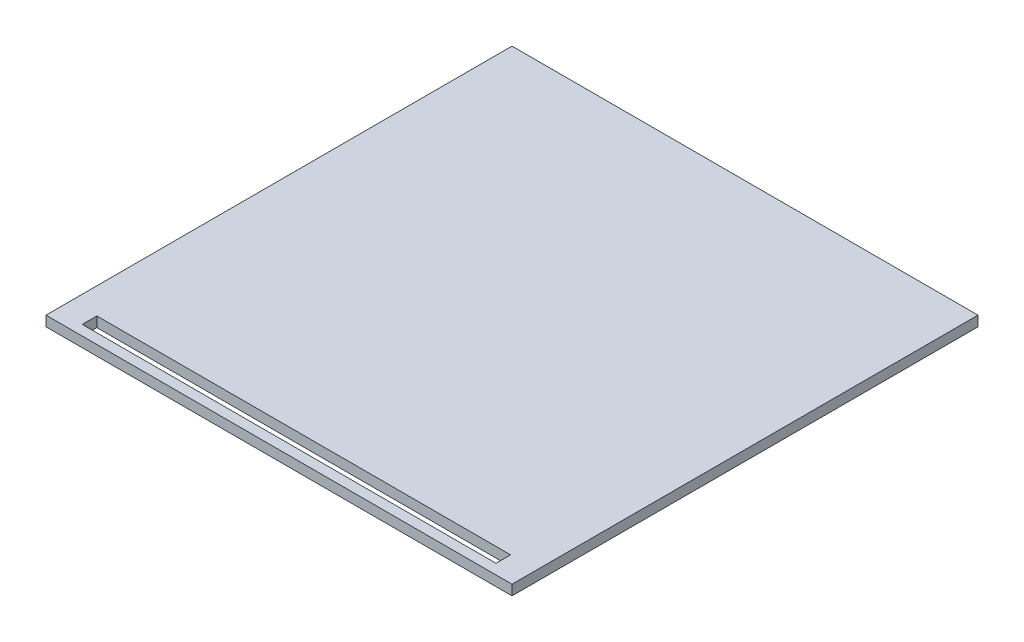
ISO-10303-21;
HEADER;
FILE_DESCRIPTION(('STEP AP214'),'2;1');
FILE_NAME('part.step','',(''),(''),'','','');
FILE_SCHEMA(('AUTOMOTIVE_DESIGN { 1 0 10303 214 1 1 1 1 }'));
ENDSEC;
DATA;
#1=APPLICATION_CONTEXT('core data for automotive mechanical design processes');
#2=APPLICATION_PROTOCOL_DEFINITION('international standard','automotive_design',2000,#1);
#3=PRODUCT_CONTEXT('',#1,'mechanical');
#4=PRODUCT('Part','Part','',(#3));
#5=PRODUCT_RELATED_PRODUCT_CATEGORY('part','',(#4));
#6=PRODUCT_DEFINITION_FORMATION('','',#4);
#7=PRODUCT_DEFINITION_CONTEXT('part definition',#1,'design');
#8=PRODUCT_DEFINITION('design','',#6,#7);
#9=PRODUCT_DEFINITION_SHAPE('','',#8);
#10=(LENGTH_UNIT() NAMED_UNIT(*) SI_UNIT(.MILLI.,.METRE.));
#11=(NAMED_UNIT(*) PLANE_ANGLE_UNIT() SI_UNIT($,.RADIAN.));
#12=(NAMED_UNIT(*) SI_UNIT($,.STERADIAN.) SOLID_ANGLE_UNIT());
#13=UNCERTAINTY_MEASURE_WITH_UNIT(LENGTH_MEASURE(1.E-05),#10,'distance_accuracy_value','');
#14=(GEOMETRIC_REPRESENTATION_CONTEXT(3) GLOBAL_UNCERTAINTY_ASSIGNED_CONTEXT((#13)) GLOBAL_UNIT_ASSIGNED_CONTEXT((#10,
#11,#12)) REPRESENTATION_CONTEXT('',''));
#15=CARTESIAN_POINT('',(0.,0.,0.));
#16=DIRECTION('',(0.,0.,1.));
#17=DIRECTION('',(1.,0.,0.));
#18=AXIS2_PLACEMENT_3D('',#15,#16,#17);
#19=CARTESIAN_POINT('',(115.,5.,115.));
#20=DIRECTION('',(-1.,0.,0.));
#21=DIRECTION('',(0.,0.,1.));
#22=AXIS2_PLACEMENT_3D('',#19,#20,#21);
#23=PLANE('',#22);
#24=DIRECTION('',(0.,0.,-1.));
#25=VECTOR('',#24,1.);
#26=CARTESIAN_POINT('',(115.,0.,115.));
#27=LINE('',#26,#25);
#28=CARTESIAN_POINT('',(115.,0.,115.));
#29=VERTEX_POINT('',#28);
#30=CARTESIAN_POINT('',(115.,0.,-115.));
#31=VERTEX_POINT('',#30);
#32=EDGE_CURVE('E131',#29,#31,#27,.T.);
#33=ORIENTED_EDGE('',*,*,#32,.T.);
#34=DIRECTION('',(0.,-1.,0.));
#35=VECTOR('',#34,1.);
#36=CARTESIAN_POINT('',(115.,5.,-115.));
#37=LINE('',#36,#35);
#38=CARTESIAN_POINT('',(115.,5.,-115.));
#39=VERTEX_POINT('',#38);
#40=EDGE_CURVE('E11',#39,#31,#37,.T.);
#41=ORIENTED_EDGE('',*,*,#40,.F.);
#42=DIRECTION('',(0.,0.,-1.));
#43=VECTOR('',#42,1.);
#44=CARTESIAN_POINT('',(115.,5.,115.));
#45=LINE('',#44,#43);
#46=CARTESIAN_POINT('',(115.,5.,115.));
#47=VERTEX_POINT('',#46);
#48=EDGE_CURVE('E135',#47,#39,#45,.T.);
#49=ORIENTED_EDGE('',*,*,#48,.F.);
#50=DIRECTION('',(0.,-1.,0.));
#51=VECTOR('',#50,1.);
#52=CARTESIAN_POINT('',(115.,5.,115.));
#53=LINE('',#52,#51);
#54=EDGE_CURVE('E145',#47,#29,#53,.T.);
#55=ORIENTED_EDGE('',*,*,#54,.T.);
#56=EDGE_LOOP('',(#33,#41,#49,#55));
#57=FACE_BOUND('',#56,.T.);
#58=ADVANCED_FACE('F34',(#57),#23,.F.);
#59=CARTESIAN_POINT('',(-115.,5.,-115.));
#60=DIRECTION('',(0.,0.,1.));
#61=DIRECTION('',(1.,0.,0.));
#62=AXIS2_PLACEMENT_3D('',#59,#60,#61);
#63=PLANE('',#62);
#64=DIRECTION('',(-1.,0.,0.));
#65=VECTOR('',#64,1.);
#66=CARTESIAN_POINT('',(-115.,0.,-115.));
#67=LINE('',#66,#65);
#68=CARTESIAN_POINT('',(-115.,0.,-115.));
#69=VERTEX_POINT('',#68);
#70=EDGE_CURVE('E148',#31,#69,#67,.T.);
#71=ORIENTED_EDGE('',*,*,#70,.T.);
#72=DIRECTION('',(0.,-1.,0.));
#73=VECTOR('',#72,1.);
#74=CARTESIAN_POINT('',(-115.,5.,-115.));
#75=LINE('',#74,#73);
#76=CARTESIAN_POINT('',(-115.,5.,-115.));
#77=VERTEX_POINT('',#76);
#78=EDGE_CURVE('E41',#77,#69,#75,.T.);
#79=ORIENTED_EDGE('',*,*,#78,.F.);
#80=DIRECTION('',(-1.,0.,0.));
#81=VECTOR('',#80,1.);
#82=CARTESIAN_POINT('',(-115.,5.,-115.));
#83=LINE('',#82,#81);
#84=EDGE_CURVE('E138',#39,#77,#83,.T.);
#85=ORIENTED_EDGE('',*,*,#84,.F.);
#86=ORIENTED_EDGE('',*,*,#40,.T.);
#87=EDGE_LOOP('',(#71,#79,#85,#86));
#88=FACE_BOUND('',#87,.T.);
#89=ADVANCED_FACE('F176',(#88),#63,.F.);
#90=CARTESIAN_POINT('',(-115.,5.,115.));
#91=DIRECTION('',(1.,0.,0.));
#92=DIRECTION('',(0.,0.,-1.));
#93=AXIS2_PLACEMENT_3D('',#90,#91,#92);
#94=PLANE('',#93);
#95=DIRECTION('',(0.,0.,1.));
#96=VECTOR('',#95,1.);
#97=CARTESIAN_POINT('',(-115.,0.,115.));
#98=LINE('',#97,#96);
#99=CARTESIAN_POINT('',(-115.,0.,115.));
#100=VERTEX_POINT('',#99);
#101=EDGE_CURVE('E150',#69,#100,#98,.T.);
#102=ORIENTED_EDGE('',*,*,#101,.T.);
#103=DIRECTION('',(0.,-1.,0.));
#104=VECTOR('',#103,1.);
#105=CARTESIAN_POINT('',(-115.,5.,115.));
#106=LINE('',#105,#104);
#107=CARTESIAN_POINT('',(-115.,5.,115.));
#108=VERTEX_POINT('',#107);
#109=EDGE_CURVE('E155',#108,#100,#106,.T.);
#110=ORIENTED_EDGE('',*,*,#109,.F.);
#111=DIRECTION('',(0.,0.,1.));
#112=VECTOR('',#111,1.);
#113=CARTESIAN_POINT('',(-115.,5.,115.));
#114=LINE('',#113,#112);
#115=EDGE_CURVE('E141',#77,#108,#114,.T.);
#116=ORIENTED_EDGE('',*,*,#115,.F.);
#117=ORIENTED_EDGE('',*,*,#78,.T.);
#118=EDGE_LOOP('',(#102,#110,#116,#117));
#119=FACE_BOUND('',#118,.T.);
#120=ADVANCED_FACE('F162',(#119),#94,.F.);
#121=CARTESIAN_POINT('',(-115.,5.,115.));
#122=DIRECTION('',(0.,0.,-1.));
#123=DIRECTION('',(-1.,0.,0.));
#124=AXIS2_PLACEMENT_3D('',#121,#122,#123);
#125=PLANE('',#124);
#126=DIRECTION('',(1.,0.,0.));
#127=VECTOR('',#126,1.);
#128=CARTESIAN_POINT('',(-115.,0.,115.));
#129=LINE('',#128,#127);
#130=EDGE_CURVE('E139',#100,#29,#129,.T.);
#131=ORIENTED_EDGE('',*,*,#130,.T.);
#132=ORIENTED_EDGE('',*,*,#54,.F.);
#133=DIRECTION('',(1.,0.,0.));
#134=VECTOR('',#133,1.);
#135=CARTESIAN_POINT('',(-115.,5.,115.));
#136=LINE('',#135,#134);
#137=EDGE_CURVE('E143',#108,#47,#136,.T.);
#138=ORIENTED_EDGE('',*,*,#137,.F.);
#139=ORIENTED_EDGE('',*,*,#109,.T.);
#140=EDGE_LOOP('',(#131,#132,#138,#139));
#141=FACE_BOUND('',#140,.T.);
#142=ADVANCED_FACE('F169',(#141),#125,.F.);
#143=CARTESIAN_POINT('',(0.,5.,0.));
#144=DIRECTION('',(0.,-1.,0.));
#145=DIRECTION('',(0.,0.,-1.));
#146=AXIS2_PLACEMENT_3D('',#143,#144,#145);
#147=PLANE('',#146);
#148=DIRECTION('',(-1.,0.,0.));
#149=VECTOR('',#148,1.);
#150=CARTESIAN_POINT('',(102.1,5.,102.8));
#151=LINE('',#150,#149);
#152=CARTESIAN_POINT('',(102.1,5.,102.8));
#153=VERTEX_POINT('',#152);
#154=CARTESIAN_POINT('',(-102.1,5.,102.8));
#155=VERTEX_POINT('',#154);
#156=EDGE_CURVE('E125',#153,#155,#151,.T.);
#157=ORIENTED_EDGE('',*,*,#156,.F.);
#158=DIRECTION('',(0.,0.,-1.));
#159=VECTOR('',#158,1.);
#160=CARTESIAN_POINT('',(102.1,5.,110.));
#161=LINE('',#160,#159);
#162=CARTESIAN_POINT('',(102.1,5.,110.));
#163=VERTEX_POINT('',#162);
#164=EDGE_CURVE('E48',#163,#153,#161,.T.);
#165=ORIENTED_EDGE('',*,*,#164,.F.);
#166=DIRECTION('',(1.,0.,0.));
#167=VECTOR('',#166,1.);
#168=CARTESIAN_POINT('',(102.1,5.,110.));
#169=LINE('',#168,#167);
#170=CARTESIAN_POINT('',(-102.1,5.,110.));
#171=VERTEX_POINT('',#170);
#172=EDGE_CURVE('E116',#171,#163,#169,.T.);
#173=ORIENTED_EDGE('',*,*,#172,.F.);
#174=DIRECTION('',(0.,0.,1.));
#175=VECTOR('',#174,1.);
#176=CARTESIAN_POINT('',(-102.1,5.,110.));
#177=LINE('',#176,#175);
#178=EDGE_CURVE('E119',#155,#171,#177,.T.);
#179=ORIENTED_EDGE('',*,*,#178,.F.);
#180=EDGE_LOOP('',(#157,#165,#173,#179));
#181=FACE_BOUND('',#180,.T.);
#182=ORIENTED_EDGE('',*,*,#48,.T.);
#183=ORIENTED_EDGE('',*,*,#84,.T.);
#184=ORIENTED_EDGE('',*,*,#115,.T.);
#185=ORIENTED_EDGE('',*,*,#137,.T.);
#186=EDGE_LOOP('',(#182,#183,#184,#185));
#187=FACE_BOUND('',#186,.T.);
#188=ADVANCED_FACE('F175',(#181,#187),#147,.F.);
#189=CARTESIAN_POINT('',(0.,0.,0.));
#190=DIRECTION('',(0.,-1.,0.));
#191=DIRECTION('',(0.,0.,-1.));
#192=AXIS2_PLACEMENT_3D('',#189,#190,#191);
#193=PLANE('',#192);
#194=DIRECTION('',(0.,0.,-1.));
#195=VECTOR('',#194,1.);
#196=CARTESIAN_POINT('',(102.1,0.,110.));
#197=LINE('',#196,#195);
#198=CARTESIAN_POINT('',(102.1,0.,110.));
#199=VERTEX_POINT('',#198);
#200=CARTESIAN_POINT('',(102.1,0.,102.8));
#201=VERTEX_POINT('',#200);
#202=EDGE_CURVE('E100',#199,#201,#197,.T.);
#203=ORIENTED_EDGE('',*,*,#202,.T.);
#204=DIRECTION('',(-1.,0.,0.));
#205=VECTOR('',#204,1.);
#206=CARTESIAN_POINT('',(102.1,0.,102.8));
#207=LINE('',#206,#205);
#208=CARTESIAN_POINT('',(-102.1,0.,102.8));
#209=VERTEX_POINT('',#208);
#210=EDGE_CURVE('E109',#201,#209,#207,.T.);
#211=ORIENTED_EDGE('',*,*,#210,.T.);
#212=DIRECTION('',(0.,0.,1.));
#213=VECTOR('',#212,1.);
#214=CARTESIAN_POINT('',(-102.1,0.,110.));
#215=LINE('',#214,#213);
#216=CARTESIAN_POINT('',(-102.1,0.,110.));
#217=VERTEX_POINT('',#216);
#218=EDGE_CURVE('E56',#209,#217,#215,.T.);
#219=ORIENTED_EDGE('',*,*,#218,.T.);
#220=DIRECTION('',(1.,0.,0.));
#221=VECTOR('',#220,1.);
#222=CARTESIAN_POINT('',(102.1,0.,110.));
#223=LINE('',#222,#221);
#224=EDGE_CURVE('E106',#217,#199,#223,.T.);
#225=ORIENTED_EDGE('',*,*,#224,.T.);
#226=EDGE_LOOP('',(#203,#211,#219,#225));
#227=FACE_BOUND('',#226,.T.);
#228=ORIENTED_EDGE('',*,*,#32,.F.);
#229=ORIENTED_EDGE('',*,*,#130,.F.);
#230=ORIENTED_EDGE('',*,*,#101,.F.);
#231=ORIENTED_EDGE('',*,*,#70,.F.);
#232=EDGE_LOOP('',(#228,#229,#230,#231));
#233=FACE_BOUND('',#232,.T.);
#234=ADVANCED_FACE('F113',(#227,#233),#193,.T.);
#235=CARTESIAN_POINT('',(102.1,0.,110.));
#236=DIRECTION('',(1.,0.,0.));
#237=DIRECTION('',(0.,0.,-1.));
#238=AXIS2_PLACEMENT_3D('',#235,#236,#237);
#239=PLANE('',#238);
#240=ORIENTED_EDGE('',*,*,#164,.T.);
#241=DIRECTION('',(0.,1.,0.));
#242=VECTOR('',#241,1.);
#243=CARTESIAN_POINT('',(102.1,0.,102.8));
#244=LINE('',#243,#242);
#245=EDGE_CURVE('E96',#201,#153,#244,.T.);
#246=ORIENTED_EDGE('',*,*,#245,.F.);
#247=ORIENTED_EDGE('',*,*,#202,.F.);
#248=DIRECTION('',(0.,1.,0.));
#249=VECTOR('',#248,1.);
#250=CARTESIAN_POINT('',(102.1,0.,110.));
#251=LINE('',#250,#249);
#252=EDGE_CURVE('E129',#199,#163,#251,.T.);
#253=ORIENTED_EDGE('',*,*,#252,.T.);
#254=EDGE_LOOP('',(#240,#246,#247,#253));
#255=FACE_BOUND('',#254,.T.);
#256=ADVANCED_FACE('F98',(#255),#239,.F.);
#257=CARTESIAN_POINT('',(102.1,0.,110.));
#258=DIRECTION('',(0.,0.,1.));
#259=DIRECTION('',(1.,0.,0.));
#260=AXIS2_PLACEMENT_3D('',#257,#258,#259);
#261=PLANE('',#260);
#262=ORIENTED_EDGE('',*,*,#172,.T.);
#263=ORIENTED_EDGE('',*,*,#252,.F.);
#264=ORIENTED_EDGE('',*,*,#224,.F.);
#265=DIRECTION('',(0.,1.,0.));
#266=VECTOR('',#265,1.);
#267=CARTESIAN_POINT('',(-102.1,0.,110.));
#268=LINE('',#267,#266);
#269=EDGE_CURVE('E132',#217,#171,#268,.T.);
#270=ORIENTED_EDGE('',*,*,#269,.T.);
#271=EDGE_LOOP('',(#262,#263,#264,#270));
#272=FACE_BOUND('',#271,.T.);
#273=ADVANCED_FACE('F193',(#272),#261,.F.);
#274=CARTESIAN_POINT('',(-102.1,0.,110.));
#275=DIRECTION('',(-1.,0.,0.));
#276=DIRECTION('',(0.,0.,1.));
#277=AXIS2_PLACEMENT_3D('',#274,#275,#276);
#278=PLANE('',#277);
#279=ORIENTED_EDGE('',*,*,#178,.T.);
#280=ORIENTED_EDGE('',*,*,#269,.F.);
#281=ORIENTED_EDGE('',*,*,#218,.F.);
#282=DIRECTION('',(0.,1.,0.));
#283=VECTOR('',#282,1.);
#284=CARTESIAN_POINT('',(-102.1,0.,102.8));
#285=LINE('',#284,#283);
#286=EDGE_CURVE('E105',#209,#155,#285,.T.);
#287=ORIENTED_EDGE('',*,*,#286,.T.);
#288=EDGE_LOOP('',(#279,#280,#281,#287));
#289=FACE_BOUND('',#288,.T.);
#290=ADVANCED_FACE('F196',(#289),#278,.F.);
#291=CARTESIAN_POINT('',(102.1,0.,102.8));
#292=DIRECTION('',(0.,0.,-1.));
#293=DIRECTION('',(-1.,0.,0.));
#294=AXIS2_PLACEMENT_3D('',#291,#292,#293);
#295=PLANE('',#294);
#296=ORIENTED_EDGE('',*,*,#156,.T.);
#297=ORIENTED_EDGE('',*,*,#286,.F.);
#298=ORIENTED_EDGE('',*,*,#210,.F.);
#299=ORIENTED_EDGE('',*,*,#245,.T.);
#300=EDGE_LOOP('',(#296,#297,#298,#299));
#301=FACE_BOUND('',#300,.T.);
#302=ADVANCED_FACE('F110',(#301),#295,.F.);
#303=CLOSED_SHELL('',(#58,#89,#120,#142,#188,#234,#256,#273,#290,#302));
#304=MANIFOLD_SOLID_BREP('B2',#303);
#305=ADVANCED_BREP_SHAPE_REPRESENTATION('',(#18,#304),#14);
#306=SHAPE_DEFINITION_REPRESENTATION(#9,#305);
ENDSEC;
END-ISO-10303-21;
